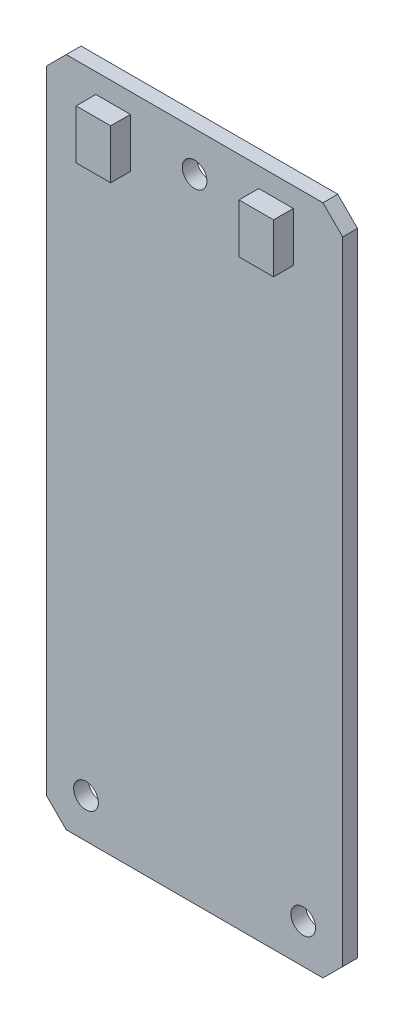
ISO-10303-21;
HEADER;
FILE_DESCRIPTION(('STEP AP214'),'2;1');
FILE_NAME('part.step','',(''),(''),'','','');
FILE_SCHEMA(('AUTOMOTIVE_DESIGN { 1 0 10303 214 1 1 1 1 }'));
ENDSEC;
DATA;
#1=APPLICATION_CONTEXT('core data for automotive mechanical design processes');
#2=APPLICATION_PROTOCOL_DEFINITION('international standard','automotive_design',2000,#1);
#3=PRODUCT_CONTEXT('',#1,'mechanical');
#4=PRODUCT('Part','Part','',(#3));
#5=PRODUCT_RELATED_PRODUCT_CATEGORY('part','',(#4));
#6=PRODUCT_DEFINITION_FORMATION('','',#4);
#7=PRODUCT_DEFINITION_CONTEXT('part definition',#1,'design');
#8=PRODUCT_DEFINITION('design','',#6,#7);
#9=PRODUCT_DEFINITION_SHAPE('','',#8);
#10=(LENGTH_UNIT() NAMED_UNIT(*) SI_UNIT(.MILLI.,.METRE.));
#11=(NAMED_UNIT(*) PLANE_ANGLE_UNIT() SI_UNIT($,.RADIAN.));
#12=(NAMED_UNIT(*) SI_UNIT($,.STERADIAN.) SOLID_ANGLE_UNIT());
#13=UNCERTAINTY_MEASURE_WITH_UNIT(LENGTH_MEASURE(1.E-05),#10,'distance_accuracy_value','');
#14=(GEOMETRIC_REPRESENTATION_CONTEXT(3) GLOBAL_UNCERTAINTY_ASSIGNED_CONTEXT((#13)) GLOBAL_UNIT_ASSIGNED_CONTEXT((#10,
#11,#12)) REPRESENTATION_CONTEXT('',''));
#15=CARTESIAN_POINT('',(0.,0.,0.));
#16=DIRECTION('',(0.,0.,1.));
#17=DIRECTION('',(1.,0.,0.));
#18=AXIS2_PLACEMENT_3D('',#15,#16,#17);
#19=CARTESIAN_POINT('',(0.,0.,1.5));
#20=DIRECTION('',(0.,0.,1.));
#21=DIRECTION('',(1.,0.,0.));
#22=AXIS2_PLACEMENT_3D('',#19,#20,#21);
#23=PLANE('',#22);
#24=CARTESIAN_POINT('',(4.,4.,1.5));
#25=DIRECTION('',(0.,0.,1.));
#26=DIRECTION('',(1.,0.,0.));
#27=AXIS2_PLACEMENT_3D('',#24,#25,#26);
#28=CIRCLE('',#27,1.25);
#29=CARTESIAN_POINT('',(5.25,4.,1.5));
#30=VERTEX_POINT('',#29);
#31=EDGE_CURVE('E244',#30,#30,#28,.T.);
#32=ORIENTED_EDGE('',*,*,#31,.F.);
#33=EDGE_LOOP('',(#32));
#34=FACE_BOUND('',#33,.T.);
#35=DIRECTION('',(1.,0.,0.));
#36=VECTOR('',#35,1.);
#37=CARTESIAN_POINT('',(0.,0.,1.5));
#38=LINE('',#37,#36);
#39=CARTESIAN_POINT('',(1.99999999999999,0.,1.5));
#40=VERTEX_POINT('',#39);
#41=CARTESIAN_POINT('',(28.,0.,1.5));
#42=VERTEX_POINT('',#41);
#43=EDGE_CURVE('E250',#40,#42,#38,.T.);
#44=ORIENTED_EDGE('',*,*,#43,.T.);
#45=DIRECTION('',(-0.707106781186548,-0.707106781186548,0.));
#46=VECTOR('',#45,1.);
#47=CARTESIAN_POINT('',(14.,-14.,1.5));
#48=LINE('',#47,#46);
#49=CARTESIAN_POINT('',(30.,2.,1.5));
#50=VERTEX_POINT('',#49);
#51=EDGE_CURVE('E304',#42,#50,#48,.F.);
#52=ORIENTED_EDGE('',*,*,#51,.T.);
#53=DIRECTION('',(0.,1.,0.));
#54=VECTOR('',#53,1.);
#55=CARTESIAN_POINT('',(30.,68.,1.5));
#56=LINE('',#55,#54);
#57=CARTESIAN_POINT('',(30.,66.,1.5));
#58=VERTEX_POINT('',#57);
#59=EDGE_CURVE('E256',#50,#58,#56,.T.);
#60=ORIENTED_EDGE('',*,*,#59,.T.);
#61=DIRECTION('',(0.707106781186546,-0.707106781186549,0.));
#62=VECTOR('',#61,1.);
#63=CARTESIAN_POINT('',(48.0000000000001,47.9999999999999,1.5));
#64=LINE('',#63,#62);
#65=CARTESIAN_POINT('',(28.,68.,1.5));
#66=VERTEX_POINT('',#65);
#67=EDGE_CURVE('E298',#58,#66,#64,.F.);
#68=ORIENTED_EDGE('',*,*,#67,.T.);
#69=DIRECTION('',(-1.,0.,0.));
#70=VECTOR('',#69,1.);
#71=CARTESIAN_POINT('',(0.,68.,1.5));
#72=LINE('',#71,#70);
#73=CARTESIAN_POINT('',(2.00000000000002,68.,1.5));
#74=VERTEX_POINT('',#73);
#75=EDGE_CURVE('E262',#66,#74,#72,.T.);
#76=ORIENTED_EDGE('',*,*,#75,.T.);
#77=DIRECTION('',(0.707106781186551,0.707106781186544,0.));
#78=VECTOR('',#77,1.);
#79=CARTESIAN_POINT('',(-33.,33.0000000000003,1.5));
#80=LINE('',#79,#78);
#81=CARTESIAN_POINT('',(0.,66.,1.5));
#82=VERTEX_POINT('',#81);
#83=EDGE_CURVE('E295',#74,#82,#80,.F.);
#84=ORIENTED_EDGE('',*,*,#83,.T.);
#85=DIRECTION('',(0.,-1.,0.));
#86=VECTOR('',#85,1.);
#87=CARTESIAN_POINT('',(0.,68.,1.5));
#88=LINE('',#87,#86);
#89=CARTESIAN_POINT('',(0.,2.,1.5));
#90=VERTEX_POINT('',#89);
#91=EDGE_CURVE('E245',#82,#90,#88,.T.);
#92=ORIENTED_EDGE('',*,*,#91,.T.);
#93=DIRECTION('',(-0.707106781186546,0.707106781186549,0.));
#94=VECTOR('',#93,1.);
#95=CARTESIAN_POINT('',(1.,0.999999999999997,1.5));
#96=LINE('',#95,#94);
#97=EDGE_CURVE('E301',#90,#40,#96,.F.);
#98=ORIENTED_EDGE('',*,*,#97,.T.);
#99=EDGE_LOOP('',(#44,#52,#60,#68,#76,#84,#92,#98));
#100=FACE_BOUND('',#99,.T.);
#101=CARTESIAN_POINT('',(15.,64.,1.5));
#102=DIRECTION('',(0.,0.,1.));
#103=DIRECTION('',(1.,0.,0.));
#104=AXIS2_PLACEMENT_3D('',#101,#102,#103);
#105=CIRCLE('',#104,1.25);
#106=CARTESIAN_POINT('',(16.25,64.,1.5));
#107=VERTEX_POINT('',#106);
#108=EDGE_CURVE('E235',#107,#107,#105,.T.);
#109=ORIENTED_EDGE('',*,*,#108,.F.);
#110=EDGE_LOOP('',(#109));
#111=FACE_BOUND('',#110,.T.);
#112=CARTESIAN_POINT('',(26.,4.,1.5));
#113=DIRECTION('',(0.,0.,1.));
#114=DIRECTION('',(1.,0.,0.));
#115=AXIS2_PLACEMENT_3D('',#112,#113,#114);
#116=CIRCLE('',#115,1.25);
#117=CARTESIAN_POINT('',(27.25,4.,1.5));
#118=VERTEX_POINT('',#117);
#119=EDGE_CURVE('E223',#118,#118,#116,.T.);
#120=ORIENTED_EDGE('',*,*,#119,.F.);
#121=EDGE_LOOP('',(#120));
#122=FACE_BOUND('',#121,.T.);
#123=DIRECTION('',(1.,0.,0.));
#124=VECTOR('',#123,1.);
#125=CARTESIAN_POINT('',(5.,61.,1.5));
#126=LINE('',#125,#124);
#127=CARTESIAN_POINT('',(5.,61.,1.5));
#128=VERTEX_POINT('',#127);
#129=CARTESIAN_POINT('',(8.5,61.,1.5));
#130=VERTEX_POINT('',#129);
#131=EDGE_CURVE('E183',#128,#130,#126,.T.);
#132=ORIENTED_EDGE('',*,*,#131,.F.);
#133=DIRECTION('',(0.,-1.,0.));
#134=VECTOR('',#133,1.);
#135=CARTESIAN_POINT('',(5.,66.,1.5));
#136=LINE('',#135,#134);
#137=CARTESIAN_POINT('',(5.,66.,1.5));
#138=VERTEX_POINT('',#137);
#139=EDGE_CURVE('E179',#138,#128,#136,.T.);
#140=ORIENTED_EDGE('',*,*,#139,.F.);
#141=DIRECTION('',(-1.,0.,0.));
#142=VECTOR('',#141,1.);
#143=CARTESIAN_POINT('',(5.,66.,1.5));
#144=LINE('',#143,#142);
#145=CARTESIAN_POINT('',(8.5,66.,1.5));
#146=VERTEX_POINT('',#145);
#147=EDGE_CURVE('E192',#146,#138,#144,.T.);
#148=ORIENTED_EDGE('',*,*,#147,.F.);
#149=DIRECTION('',(0.,1.,0.));
#150=VECTOR('',#149,1.);
#151=CARTESIAN_POINT('',(8.5,66.,1.5));
#152=LINE('',#151,#150);
#153=EDGE_CURVE('E212',#130,#146,#152,.T.);
#154=ORIENTED_EDGE('',*,*,#153,.F.);
#155=EDGE_LOOP('',(#132,#140,#148,#154));
#156=FACE_BOUND('',#155,.T.);
#157=DIRECTION('',(-1.,0.,0.));
#158=VECTOR('',#157,1.);
#159=CARTESIAN_POINT('',(25.,66.,1.5));
#160=LINE('',#159,#158);
#161=CARTESIAN_POINT('',(25.,66.,1.5));
#162=VERTEX_POINT('',#161);
#163=CARTESIAN_POINT('',(21.5,66.,1.5));
#164=VERTEX_POINT('',#163);
#165=EDGE_CURVE('E356',#162,#164,#160,.T.);
#166=ORIENTED_EDGE('',*,*,#165,.F.);
#167=DIRECTION('',(0.,1.,0.));
#168=VECTOR('',#167,1.);
#169=CARTESIAN_POINT('',(25.,66.,1.5));
#170=LINE('',#169,#168);
#171=CARTESIAN_POINT('',(25.,61.,1.5));
#172=VERTEX_POINT('',#171);
#173=EDGE_CURVE('E177',#172,#162,#170,.T.);
#174=ORIENTED_EDGE('',*,*,#173,.F.);
#175=DIRECTION('',(1.,0.,0.));
#176=VECTOR('',#175,1.);
#177=CARTESIAN_POINT('',(25.,61.,1.5));
#178=LINE('',#177,#176);
#179=CARTESIAN_POINT('',(21.5,61.,1.5));
#180=VERTEX_POINT('',#179);
#181=EDGE_CURVE('E173',#180,#172,#178,.T.);
#182=ORIENTED_EDGE('',*,*,#181,.F.);
#183=DIRECTION('',(0.,-1.,0.));
#184=VECTOR('',#183,1.);
#185=CARTESIAN_POINT('',(21.5,66.,1.5));
#186=LINE('',#185,#184);
#187=EDGE_CURVE('E358',#164,#180,#186,.T.);
#188=ORIENTED_EDGE('',*,*,#187,.F.);
#189=EDGE_LOOP('',(#166,#174,#182,#188));
#190=FACE_BOUND('',#189,.T.);
#191=ADVANCED_FACE('F39',(#34,#100,#111,#122,#156,#190),#23,.T.);
#192=CARTESIAN_POINT('',(0.,0.,0.));
#193=DIRECTION('',(0.,0.,1.));
#194=DIRECTION('',(1.,0.,0.));
#195=AXIS2_PLACEMENT_3D('',#192,#193,#194);
#196=PLANE('',#195);
#197=DIRECTION('',(0.,1.,0.));
#198=VECTOR('',#197,1.);
#199=CARTESIAN_POINT('',(30.,68.,0.));
#200=LINE('',#199,#198);
#201=CARTESIAN_POINT('',(30.,2.,0.));
#202=VERTEX_POINT('',#201);
#203=CARTESIAN_POINT('',(30.,66.,0.));
#204=VERTEX_POINT('',#203);
#205=EDGE_CURVE('E273',#202,#204,#200,.T.);
#206=ORIENTED_EDGE('',*,*,#205,.F.);
#207=DIRECTION('',(0.707106781186548,0.707106781186548,0.));
#208=VECTOR('',#207,1.);
#209=CARTESIAN_POINT('',(30.,2.,0.));
#210=LINE('',#209,#208);
#211=CARTESIAN_POINT('',(28.,0.,0.));
#212=VERTEX_POINT('',#211);
#213=EDGE_CURVE('E288',#202,#212,#210,.F.);
#214=ORIENTED_EDGE('',*,*,#213,.T.);
#215=DIRECTION('',(1.,0.,0.));
#216=VECTOR('',#215,1.);
#217=CARTESIAN_POINT('',(0.,0.,0.));
#218=LINE('',#217,#216);
#219=CARTESIAN_POINT('',(1.99999999999999,0.,0.));
#220=VERTEX_POINT('',#219);
#221=EDGE_CURVE('E270',#220,#212,#218,.T.);
#222=ORIENTED_EDGE('',*,*,#221,.F.);
#223=DIRECTION('',(0.707106781186546,-0.707106781186549,0.));
#224=VECTOR('',#223,1.);
#225=CARTESIAN_POINT('',(1.99999999999999,0.,0.));
#226=LINE('',#225,#224);
#227=CARTESIAN_POINT('',(0.,2.,0.));
#228=VERTEX_POINT('',#227);
#229=EDGE_CURVE('E286',#220,#228,#226,.F.);
#230=ORIENTED_EDGE('',*,*,#229,.T.);
#231=DIRECTION('',(0.,-1.,0.));
#232=VECTOR('',#231,1.);
#233=CARTESIAN_POINT('',(0.,68.,0.));
#234=LINE('',#233,#232);
#235=CARTESIAN_POINT('',(0.,66.,0.));
#236=VERTEX_POINT('',#235);
#237=EDGE_CURVE('E241',#236,#228,#234,.T.);
#238=ORIENTED_EDGE('',*,*,#237,.F.);
#239=DIRECTION('',(-0.707106781186551,-0.707106781186544,0.));
#240=VECTOR('',#239,1.);
#241=CARTESIAN_POINT('',(0.,66.,0.));
#242=LINE('',#241,#240);
#243=CARTESIAN_POINT('',(2.00000000000002,68.,0.));
#244=VERTEX_POINT('',#243);
#245=EDGE_CURVE('E282',#236,#244,#242,.F.);
#246=ORIENTED_EDGE('',*,*,#245,.T.);
#247=DIRECTION('',(-1.,0.,0.));
#248=VECTOR('',#247,1.);
#249=CARTESIAN_POINT('',(0.,68.,0.));
#250=LINE('',#249,#248);
#251=CARTESIAN_POINT('',(28.,68.,0.));
#252=VERTEX_POINT('',#251);
#253=EDGE_CURVE('E251',#252,#244,#250,.T.);
#254=ORIENTED_EDGE('',*,*,#253,.F.);
#255=DIRECTION('',(-0.707106781186546,0.707106781186549,0.));
#256=VECTOR('',#255,1.);
#257=CARTESIAN_POINT('',(28.,68.,0.));
#258=LINE('',#257,#256);
#259=EDGE_CURVE('E284',#252,#204,#258,.F.);
#260=ORIENTED_EDGE('',*,*,#259,.T.);
#261=EDGE_LOOP('',(#206,#214,#222,#230,#238,#246,#254,#260));
#262=FACE_BOUND('',#261,.T.);
#263=CARTESIAN_POINT('',(15.,64.,0.));
#264=DIRECTION('',(0.,0.,1.));
#265=DIRECTION('',(1.,0.,0.));
#266=AXIS2_PLACEMENT_3D('',#263,#264,#265);
#267=CIRCLE('',#266,1.25);
#268=CARTESIAN_POINT('',(16.25,64.,0.));
#269=VERTEX_POINT('',#268);
#270=EDGE_CURVE('E242',#269,#269,#267,.T.);
#271=ORIENTED_EDGE('',*,*,#270,.T.);
#272=EDGE_LOOP('',(#271));
#273=FACE_BOUND('',#272,.T.);
#274=CARTESIAN_POINT('',(4.,4.,0.));
#275=DIRECTION('',(0.,0.,1.));
#276=DIRECTION('',(1.,0.,0.));
#277=AXIS2_PLACEMENT_3D('',#274,#275,#276);
#278=CIRCLE('',#277,1.25);
#279=CARTESIAN_POINT('',(5.25,4.,0.));
#280=VERTEX_POINT('',#279);
#281=EDGE_CURVE('E228',#280,#280,#278,.T.);
#282=ORIENTED_EDGE('',*,*,#281,.T.);
#283=EDGE_LOOP('',(#282));
#284=FACE_BOUND('',#283,.T.);
#285=CARTESIAN_POINT('',(26.,4.,0.));
#286=DIRECTION('',(0.,0.,1.));
#287=DIRECTION('',(1.,0.,0.));
#288=AXIS2_PLACEMENT_3D('',#285,#286,#287);
#289=CIRCLE('',#288,1.25);
#290=CARTESIAN_POINT('',(27.25,4.,0.));
#291=VERTEX_POINT('',#290);
#292=EDGE_CURVE('E222',#291,#291,#289,.T.);
#293=ORIENTED_EDGE('',*,*,#292,.T.);
#294=EDGE_LOOP('',(#293));
#295=FACE_BOUND('',#294,.T.);
#296=ADVANCED_FACE('F331',(#262,#273,#284,#295),#196,.F.);
#297=CARTESIAN_POINT('',(0.,68.,1.5));
#298=DIRECTION('',(1.,0.,0.));
#299=DIRECTION('',(0.,1.,0.));
#300=AXIS2_PLACEMENT_3D('',#297,#298,#299);
#301=PLANE('',#300);
#302=ORIENTED_EDGE('',*,*,#237,.T.);
#303=DIRECTION('',(0.,0.,1.));
#304=VECTOR('',#303,1.);
#305=CARTESIAN_POINT('',(0.,2.,1.5));
#306=LINE('',#305,#304);
#307=EDGE_CURVE('E310',#228,#90,#306,.T.);
#308=ORIENTED_EDGE('',*,*,#307,.T.);
#309=ORIENTED_EDGE('',*,*,#91,.F.);
#310=DIRECTION('',(0.,0.,-1.));
#311=VECTOR('',#310,1.);
#312=CARTESIAN_POINT('',(0.,66.,1.5));
#313=LINE('',#312,#311);
#314=EDGE_CURVE('E307',#82,#236,#313,.T.);
#315=ORIENTED_EDGE('',*,*,#314,.T.);
#316=EDGE_LOOP('',(#302,#308,#309,#315));
#317=FACE_BOUND('',#316,.T.);
#318=ADVANCED_FACE('F327',(#317),#301,.F.);
#319=CARTESIAN_POINT('',(0.,0.,1.5));
#320=DIRECTION('',(0.,1.,0.));
#321=DIRECTION('',(0.,0.,1.));
#322=AXIS2_PLACEMENT_3D('',#319,#320,#321);
#323=PLANE('',#322);
#324=ORIENTED_EDGE('',*,*,#221,.T.);
#325=DIRECTION('',(0.,0.,1.));
#326=VECTOR('',#325,1.);
#327=CARTESIAN_POINT('',(28.,0.,1.5));
#328=LINE('',#327,#326);
#329=EDGE_CURVE('E293',#212,#42,#328,.T.);
#330=ORIENTED_EDGE('',*,*,#329,.T.);
#331=ORIENTED_EDGE('',*,*,#43,.F.);
#332=DIRECTION('',(0.,0.,-1.));
#333=VECTOR('',#332,1.);
#334=CARTESIAN_POINT('',(1.99999999999999,0.,1.5));
#335=LINE('',#334,#333);
#336=EDGE_CURVE('E290',#40,#220,#335,.T.);
#337=ORIENTED_EDGE('',*,*,#336,.T.);
#338=EDGE_LOOP('',(#324,#330,#331,#337));
#339=FACE_BOUND('',#338,.T.);
#340=ADVANCED_FACE('F340',(#339),#323,.F.);
#341=CARTESIAN_POINT('',(30.,68.,1.5));
#342=DIRECTION('',(-1.,0.,0.));
#343=DIRECTION('',(0.,-1.,0.));
#344=AXIS2_PLACEMENT_3D('',#341,#342,#343);
#345=PLANE('',#344);
#346=ORIENTED_EDGE('',*,*,#59,.F.);
#347=DIRECTION('',(0.,0.,-1.));
#348=VECTOR('',#347,1.);
#349=CARTESIAN_POINT('',(30.,2.,1.5));
#350=LINE('',#349,#348);
#351=EDGE_CURVE('E279',#50,#202,#350,.T.);
#352=ORIENTED_EDGE('',*,*,#351,.T.);
#353=ORIENTED_EDGE('',*,*,#205,.T.);
#354=DIRECTION('',(0.,0.,1.));
#355=VECTOR('',#354,1.);
#356=CARTESIAN_POINT('',(30.,66.,1.5));
#357=LINE('',#356,#355);
#358=EDGE_CURVE('E267',#204,#58,#357,.T.);
#359=ORIENTED_EDGE('',*,*,#358,.T.);
#360=EDGE_LOOP('',(#346,#352,#353,#359));
#361=FACE_BOUND('',#360,.T.);
#362=ADVANCED_FACE('F348',(#361),#345,.F.);
#363=CARTESIAN_POINT('',(0.,68.,1.5));
#364=DIRECTION('',(0.,-1.,0.));
#365=DIRECTION('',(0.,0.,-1.));
#366=AXIS2_PLACEMENT_3D('',#363,#364,#365);
#367=PLANE('',#366);
#368=ORIENTED_EDGE('',*,*,#75,.F.);
#369=DIRECTION('',(0.,0.,-1.));
#370=VECTOR('',#369,1.);
#371=CARTESIAN_POINT('',(28.,68.,1.5));
#372=LINE('',#371,#370);
#373=EDGE_CURVE('E12',#66,#252,#372,.T.);
#374=ORIENTED_EDGE('',*,*,#373,.T.);
#375=ORIENTED_EDGE('',*,*,#253,.T.);
#376=DIRECTION('',(0.,0.,1.));
#377=VECTOR('',#376,1.);
#378=CARTESIAN_POINT('',(2.00000000000002,68.,1.5));
#379=LINE('',#378,#377);
#380=EDGE_CURVE('E48',#244,#74,#379,.T.);
#381=ORIENTED_EDGE('',*,*,#380,.T.);
#382=EDGE_LOOP('',(#368,#374,#375,#381));
#383=FACE_BOUND('',#382,.T.);
#384=ADVANCED_FACE('F314',(#383),#367,.F.);
#385=CARTESIAN_POINT('',(15.,64.,1.5));
#386=DIRECTION('',(0.,0.,-1.));
#387=DIRECTION('',(-1.,0.,0.));
#388=AXIS2_PLACEMENT_3D('',#385,#386,#387);
#389=CYLINDRICAL_SURFACE('',#388,1.25);
#390=ORIENTED_EDGE('',*,*,#108,.T.);
#391=EDGE_LOOP('',(#390));
#392=FACE_BOUND('',#391,.T.);
#393=ORIENTED_EDGE('',*,*,#270,.F.);
#394=EDGE_LOOP('',(#393));
#395=FACE_BOUND('',#394,.T.);
#396=ADVANCED_FACE('F388',(#392,#395),#389,.F.);
#397=CARTESIAN_POINT('',(4.,4.,1.5));
#398=DIRECTION('',(0.,0.,-1.));
#399=DIRECTION('',(-1.,0.,0.));
#400=AXIS2_PLACEMENT_3D('',#397,#398,#399);
#401=CYLINDRICAL_SURFACE('',#400,1.25);
#402=ORIENTED_EDGE('',*,*,#31,.T.);
#403=EDGE_LOOP('',(#402));
#404=FACE_BOUND('',#403,.T.);
#405=ORIENTED_EDGE('',*,*,#281,.F.);
#406=EDGE_LOOP('',(#405));
#407=FACE_BOUND('',#406,.T.);
#408=ADVANCED_FACE('F432',(#404,#407),#401,.F.);
#409=CARTESIAN_POINT('',(26.,4.,1.5));
#410=DIRECTION('',(0.,0.,-1.));
#411=DIRECTION('',(-1.,0.,0.));
#412=AXIS2_PLACEMENT_3D('',#409,#410,#411);
#413=CYLINDRICAL_SURFACE('',#412,1.25);
#414=ORIENTED_EDGE('',*,*,#119,.T.);
#415=EDGE_LOOP('',(#414));
#416=FACE_BOUND('',#415,.T.);
#417=ORIENTED_EDGE('',*,*,#292,.F.);
#418=EDGE_LOOP('',(#417));
#419=FACE_BOUND('',#418,.T.);
#420=ADVANCED_FACE('F405',(#416,#419),#413,.F.);
#421=CARTESIAN_POINT('',(30.,2.,1.5));
#422=DIRECTION('',(-0.707106781186547,0.707106781186547,0.));
#423=DIRECTION('',(0.,0.,-1.));
#424=AXIS2_PLACEMENT_3D('',#421,#422,#423);
#425=PLANE('',#424);
#426=ORIENTED_EDGE('',*,*,#51,.F.);
#427=ORIENTED_EDGE('',*,*,#329,.F.);
#428=ORIENTED_EDGE('',*,*,#213,.F.);
#429=ORIENTED_EDGE('',*,*,#351,.F.);
#430=EDGE_LOOP('',(#426,#427,#428,#429));
#431=FACE_BOUND('',#430,.T.);
#432=ADVANCED_FACE('F346',(#431),#425,.F.);
#433=CARTESIAN_POINT('',(1.99999999999999,0.,1.5));
#434=DIRECTION('',(0.707106781186549,0.707106781186546,0.));
#435=DIRECTION('',(0.,0.,-1.));
#436=AXIS2_PLACEMENT_3D('',#433,#434,#435);
#437=PLANE('',#436);
#438=ORIENTED_EDGE('',*,*,#97,.F.);
#439=ORIENTED_EDGE('',*,*,#307,.F.);
#440=ORIENTED_EDGE('',*,*,#229,.F.);
#441=ORIENTED_EDGE('',*,*,#336,.F.);
#442=EDGE_LOOP('',(#438,#439,#440,#441));
#443=FACE_BOUND('',#442,.T.);
#444=ADVANCED_FACE('F337',(#443),#437,.F.);
#445=CARTESIAN_POINT('',(28.,68.,1.5));
#446=DIRECTION('',(-0.707106781186549,-0.707106781186546,0.));
#447=DIRECTION('',(0.,0.,-1.));
#448=AXIS2_PLACEMENT_3D('',#445,#446,#447);
#449=PLANE('',#448);
#450=ORIENTED_EDGE('',*,*,#67,.F.);
#451=ORIENTED_EDGE('',*,*,#358,.F.);
#452=ORIENTED_EDGE('',*,*,#259,.F.);
#453=ORIENTED_EDGE('',*,*,#373,.F.);
#454=EDGE_LOOP('',(#450,#451,#452,#453));
#455=FACE_BOUND('',#454,.T.);
#456=ADVANCED_FACE('F351',(#455),#449,.F.);
#457=CARTESIAN_POINT('',(0.,66.,1.5));
#458=DIRECTION('',(0.707106781186544,-0.707106781186551,0.));
#459=DIRECTION('',(0.,0.,-1.));
#460=AXIS2_PLACEMENT_3D('',#457,#458,#459);
#461=PLANE('',#460);
#462=ORIENTED_EDGE('',*,*,#83,.F.);
#463=ORIENTED_EDGE('',*,*,#380,.F.);
#464=ORIENTED_EDGE('',*,*,#245,.F.);
#465=ORIENTED_EDGE('',*,*,#314,.F.);
#466=EDGE_LOOP('',(#462,#463,#464,#465));
#467=FACE_BOUND('',#466,.T.);
#468=ADVANCED_FACE('F42',(#467),#461,.F.);
#469=CARTESIAN_POINT('',(5.,66.,3.5));
#470=DIRECTION('',(1.,0.,0.));
#471=DIRECTION('',(0.,1.,0.));
#472=AXIS2_PLACEMENT_3D('',#469,#470,#471);
#473=PLANE('',#472);
#474=ORIENTED_EDGE('',*,*,#139,.T.);
#475=DIRECTION('',(0.,0.,-1.));
#476=VECTOR('',#475,1.);
#477=CARTESIAN_POINT('',(5.,61.,3.5));
#478=LINE('',#477,#476);
#479=CARTESIAN_POINT('',(5.,61.,3.5));
#480=VERTEX_POINT('',#479);
#481=EDGE_CURVE('E220',#480,#128,#478,.T.);
#482=ORIENTED_EDGE('',*,*,#481,.F.);
#483=DIRECTION('',(0.,-1.,0.));
#484=VECTOR('',#483,1.);
#485=CARTESIAN_POINT('',(5.,66.,3.5));
#486=LINE('',#485,#484);
#487=CARTESIAN_POINT('',(5.,66.,3.5));
#488=VERTEX_POINT('',#487);
#489=EDGE_CURVE('E188',#488,#480,#486,.T.);
#490=ORIENTED_EDGE('',*,*,#489,.F.);
#491=DIRECTION('',(0.,0.,-1.));
#492=VECTOR('',#491,1.);
#493=CARTESIAN_POINT('',(5.,66.,3.5));
#494=LINE('',#493,#492);
#495=EDGE_CURVE('E197',#488,#138,#494,.T.);
#496=ORIENTED_EDGE('',*,*,#495,.T.);
#497=EDGE_LOOP('',(#474,#482,#490,#496));
#498=FACE_BOUND('',#497,.T.);
#499=ADVANCED_FACE('F416',(#498),#473,.F.);
#500=CARTESIAN_POINT('',(5.,61.,3.5));
#501=DIRECTION('',(0.,1.,0.));
#502=DIRECTION('',(0.,0.,1.));
#503=AXIS2_PLACEMENT_3D('',#500,#501,#502);
#504=PLANE('',#503);
#505=ORIENTED_EDGE('',*,*,#131,.T.);
#506=DIRECTION('',(0.,0.,-1.));
#507=VECTOR('',#506,1.);
#508=CARTESIAN_POINT('',(8.5,61.,3.5));
#509=LINE('',#508,#507);
#510=CARTESIAN_POINT('',(8.5,61.,3.5));
#511=VERTEX_POINT('',#510);
#512=EDGE_CURVE('E217',#511,#130,#509,.T.);
#513=ORIENTED_EDGE('',*,*,#512,.F.);
#514=DIRECTION('',(1.,0.,0.));
#515=VECTOR('',#514,1.);
#516=CARTESIAN_POINT('',(5.,61.,3.5));
#517=LINE('',#516,#515);
#518=EDGE_CURVE('E191',#480,#511,#517,.T.);
#519=ORIENTED_EDGE('',*,*,#518,.F.);
#520=ORIENTED_EDGE('',*,*,#481,.T.);
#521=EDGE_LOOP('',(#505,#513,#519,#520));
#522=FACE_BOUND('',#521,.T.);
#523=ADVANCED_FACE('F420',(#522),#504,.F.);
#524=CARTESIAN_POINT('',(8.5,66.,3.5));
#525=DIRECTION('',(-1.,0.,0.));
#526=DIRECTION('',(0.,-1.,0.));
#527=AXIS2_PLACEMENT_3D('',#524,#525,#526);
#528=PLANE('',#527);
#529=ORIENTED_EDGE('',*,*,#153,.T.);
#530=DIRECTION('',(0.,0.,-1.));
#531=VECTOR('',#530,1.);
#532=CARTESIAN_POINT('',(8.5,66.,3.5));
#533=LINE('',#532,#531);
#534=CARTESIAN_POINT('',(8.5,66.,3.5));
#535=VERTEX_POINT('',#534);
#536=EDGE_CURVE('E63',#535,#146,#533,.T.);
#537=ORIENTED_EDGE('',*,*,#536,.F.);
#538=DIRECTION('',(0.,1.,0.));
#539=VECTOR('',#538,1.);
#540=CARTESIAN_POINT('',(8.5,66.,3.5));
#541=LINE('',#540,#539);
#542=EDGE_CURVE('E194',#511,#535,#541,.T.);
#543=ORIENTED_EDGE('',*,*,#542,.F.);
#544=ORIENTED_EDGE('',*,*,#512,.T.);
#545=EDGE_LOOP('',(#529,#537,#543,#544));
#546=FACE_BOUND('',#545,.T.);
#547=ADVANCED_FACE('F426',(#546),#528,.F.);
#548=CARTESIAN_POINT('',(5.,66.,3.5));
#549=DIRECTION('',(0.,-1.,0.));
#550=DIRECTION('',(0.,0.,-1.));
#551=AXIS2_PLACEMENT_3D('',#548,#549,#550);
#552=PLANE('',#551);
#553=ORIENTED_EDGE('',*,*,#147,.T.);
#554=ORIENTED_EDGE('',*,*,#495,.F.);
#555=DIRECTION('',(-1.,0.,0.));
#556=VECTOR('',#555,1.);
#557=CARTESIAN_POINT('',(5.,66.,3.5));
#558=LINE('',#557,#556);
#559=EDGE_CURVE('E196',#535,#488,#558,.T.);
#560=ORIENTED_EDGE('',*,*,#559,.F.);
#561=ORIENTED_EDGE('',*,*,#536,.T.);
#562=EDGE_LOOP('',(#553,#554,#560,#561));
#563=FACE_BOUND('',#562,.T.);
#564=ADVANCED_FACE('F471',(#563),#552,.F.);
#565=CARTESIAN_POINT('',(0.,0.,3.5));
#566=DIRECTION('',(0.,0.,1.));
#567=DIRECTION('',(1.,0.,0.));
#568=AXIS2_PLACEMENT_3D('',#565,#566,#567);
#569=PLANE('',#568);
#570=ORIENTED_EDGE('',*,*,#489,.T.);
#571=ORIENTED_EDGE('',*,*,#518,.T.);
#572=ORIENTED_EDGE('',*,*,#542,.T.);
#573=ORIENTED_EDGE('',*,*,#559,.T.);
#574=EDGE_LOOP('',(#570,#571,#572,#573));
#575=FACE_BOUND('',#574,.T.);
#576=ADVANCED_FACE('F468',(#575),#569,.T.);
#577=CARTESIAN_POINT('',(25.,66.,3.5));
#578=DIRECTION('',(-1.,0.,0.));
#579=DIRECTION('',(0.,0.,1.));
#580=AXIS2_PLACEMENT_3D('',#577,#578,#579);
#581=PLANE('',#580);
#582=ORIENTED_EDGE('',*,*,#173,.T.);
#583=DIRECTION('',(0.,0.,-1.));
#584=VECTOR('',#583,1.);
#585=CARTESIAN_POINT('',(25.,66.,3.5));
#586=LINE('',#585,#584);
#587=CARTESIAN_POINT('',(25.,66.,3.5));
#588=VERTEX_POINT('',#587);
#589=EDGE_CURVE('E158',#588,#162,#586,.T.);
#590=ORIENTED_EDGE('',*,*,#589,.F.);
#591=DIRECTION('',(0.,1.,0.));
#592=VECTOR('',#591,1.);
#593=CARTESIAN_POINT('',(25.,66.,3.5));
#594=LINE('',#593,#592);
#595=CARTESIAN_POINT('',(25.,61.,3.5));
#596=VERTEX_POINT('',#595);
#597=EDGE_CURVE('E165',#596,#588,#594,.T.);
#598=ORIENTED_EDGE('',*,*,#597,.F.);
#599=DIRECTION('',(0.,0.,-1.));
#600=VECTOR('',#599,1.);
#601=CARTESIAN_POINT('',(25.,61.,3.5));
#602=LINE('',#601,#600);
#603=EDGE_CURVE('E371',#596,#172,#602,.T.);
#604=ORIENTED_EDGE('',*,*,#603,.T.);
#605=EDGE_LOOP('',(#582,#590,#598,#604));
#606=FACE_BOUND('',#605,.T.);
#607=ADVANCED_FACE('F175',(#606),#581,.F.);
#608=CARTESIAN_POINT('',(25.,66.,3.5));
#609=DIRECTION('',(0.,-1.,0.));
#610=DIRECTION('',(0.,0.,-1.));
#611=AXIS2_PLACEMENT_3D('',#608,#609,#610);
#612=PLANE('',#611);
#613=ORIENTED_EDGE('',*,*,#165,.T.);
#614=DIRECTION('',(0.,0.,-1.));
#615=VECTOR('',#614,1.);
#616=CARTESIAN_POINT('',(21.5,66.,3.5));
#617=LINE('',#616,#615);
#618=CARTESIAN_POINT('',(21.5,66.,3.5));
#619=VERTEX_POINT('',#618);
#620=EDGE_CURVE('E161',#619,#164,#617,.T.);
#621=ORIENTED_EDGE('',*,*,#620,.F.);
#622=DIRECTION('',(-1.,0.,0.));
#623=VECTOR('',#622,1.);
#624=CARTESIAN_POINT('',(25.,66.,3.5));
#625=LINE('',#624,#623);
#626=EDGE_CURVE('E154',#588,#619,#625,.T.);
#627=ORIENTED_EDGE('',*,*,#626,.F.);
#628=ORIENTED_EDGE('',*,*,#589,.T.);
#629=EDGE_LOOP('',(#613,#621,#627,#628));
#630=FACE_BOUND('',#629,.T.);
#631=ADVANCED_FACE('F156',(#630),#612,.F.);
#632=CARTESIAN_POINT('',(21.5,66.,3.5));
#633=DIRECTION('',(1.,0.,0.));
#634=DIRECTION('',(0.,0.,-1.));
#635=AXIS2_PLACEMENT_3D('',#632,#633,#634);
#636=PLANE('',#635);
#637=ORIENTED_EDGE('',*,*,#187,.T.);
#638=DIRECTION('',(0.,0.,-1.));
#639=VECTOR('',#638,1.);
#640=CARTESIAN_POINT('',(21.5,61.,3.5));
#641=LINE('',#640,#639);
#642=CARTESIAN_POINT('',(21.5,61.,3.5));
#643=VERTEX_POINT('',#642);
#644=EDGE_CURVE('E55',#643,#180,#641,.T.);
#645=ORIENTED_EDGE('',*,*,#644,.F.);
#646=DIRECTION('',(0.,-1.,0.));
#647=VECTOR('',#646,1.);
#648=CARTESIAN_POINT('',(21.5,66.,3.5));
#649=LINE('',#648,#647);
#650=EDGE_CURVE('E164',#619,#643,#649,.T.);
#651=ORIENTED_EDGE('',*,*,#650,.F.);
#652=ORIENTED_EDGE('',*,*,#620,.T.);
#653=EDGE_LOOP('',(#637,#645,#651,#652));
#654=FACE_BOUND('',#653,.T.);
#655=ADVANCED_FACE('F376',(#654),#636,.F.);
#656=CARTESIAN_POINT('',(25.,61.,3.5));
#657=DIRECTION('',(0.,1.,0.));
#658=DIRECTION('',(0.,0.,1.));
#659=AXIS2_PLACEMENT_3D('',#656,#657,#658);
#660=PLANE('',#659);
#661=ORIENTED_EDGE('',*,*,#181,.T.);
#662=ORIENTED_EDGE('',*,*,#603,.F.);
#663=DIRECTION('',(1.,0.,0.));
#664=VECTOR('',#663,1.);
#665=CARTESIAN_POINT('',(25.,61.,3.5));
#666=LINE('',#665,#664);
#667=EDGE_CURVE('E169',#643,#596,#666,.T.);
#668=ORIENTED_EDGE('',*,*,#667,.F.);
#669=ORIENTED_EDGE('',*,*,#644,.T.);
#670=EDGE_LOOP('',(#661,#662,#668,#669));
#671=FACE_BOUND('',#670,.T.);
#672=ADVANCED_FACE('F377',(#671),#660,.F.);
#673=CARTESIAN_POINT('',(0.,0.,3.5));
#674=DIRECTION('',(0.,0.,-1.));
#675=DIRECTION('',(-1.,0.,0.));
#676=AXIS2_PLACEMENT_3D('',#673,#674,#675);
#677=PLANE('',#676);
#678=ORIENTED_EDGE('',*,*,#597,.T.);
#679=ORIENTED_EDGE('',*,*,#626,.T.);
#680=ORIENTED_EDGE('',*,*,#650,.T.);
#681=ORIENTED_EDGE('',*,*,#667,.T.);
#682=EDGE_LOOP('',(#678,#679,#680,#681));
#683=FACE_BOUND('',#682,.T.);
#684=ADVANCED_FACE('F168',(#683),#677,.F.);
#685=CLOSED_SHELL('',(#191,#296,#318,#340,#362,#384,#396,#408,#420,#432,#444,#456,#468,#499,
#523,#547,#564,#576,#607,#631,#655,#672,#684));
#686=MANIFOLD_SOLID_BREP('B2',#685);
#687=ADVANCED_BREP_SHAPE_REPRESENTATION('',(#18,#686),#14);
#688=SHAPE_DEFINITION_REPRESENTATION(#9,#687);
ENDSEC;
END-ISO-10303-21;
